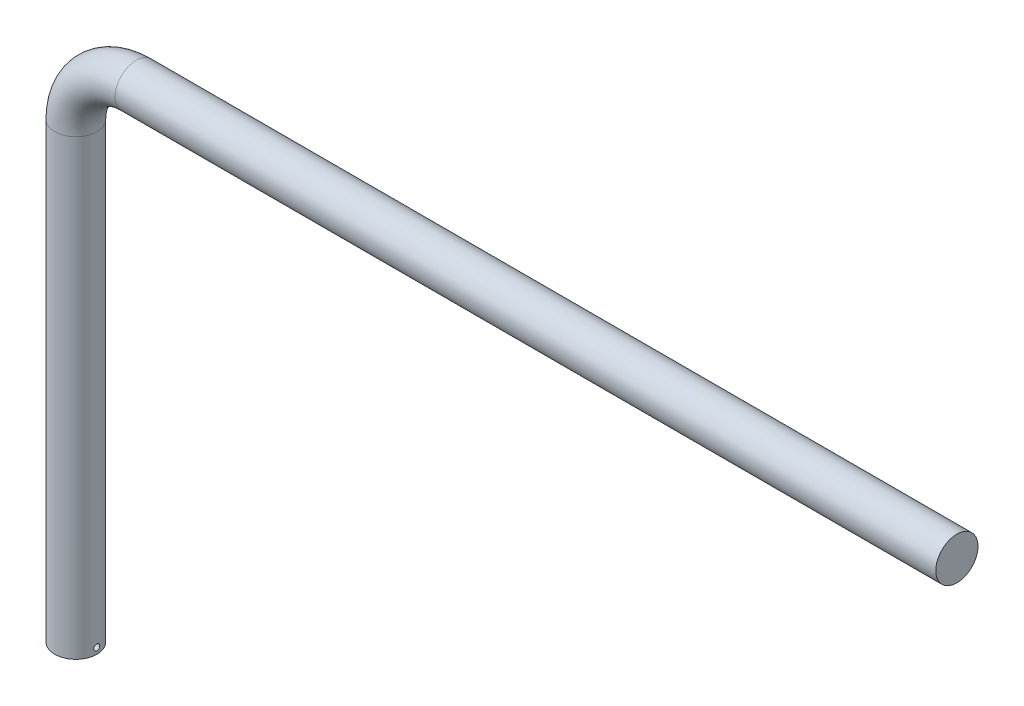
ISO-10303-21;
HEADER;
FILE_DESCRIPTION(('STEP AP214'),'2;1');
FILE_NAME('part.step','',(''),(''),'','','');
FILE_SCHEMA(('AUTOMOTIVE_DESIGN { 1 0 10303 214 1 1 1 1 }'));
ENDSEC;
DATA;
#1=APPLICATION_CONTEXT('core data for automotive mechanical design processes');
#2=APPLICATION_PROTOCOL_DEFINITION('international standard','automotive_design',2000,#1);
#3=PRODUCT_CONTEXT('',#1,'mechanical');
#4=PRODUCT('Part','Part','',(#3));
#5=PRODUCT_RELATED_PRODUCT_CATEGORY('part','',(#4));
#6=PRODUCT_DEFINITION_FORMATION('','',#4);
#7=PRODUCT_DEFINITION_CONTEXT('part definition',#1,'design');
#8=PRODUCT_DEFINITION('design','',#6,#7);
#9=PRODUCT_DEFINITION_SHAPE('','',#8);
#10=(LENGTH_UNIT() NAMED_UNIT(*) SI_UNIT(.MILLI.,.METRE.));
#11=(NAMED_UNIT(*) PLANE_ANGLE_UNIT() SI_UNIT($,.RADIAN.));
#12=(NAMED_UNIT(*) SI_UNIT($,.STERADIAN.) SOLID_ANGLE_UNIT());
#13=UNCERTAINTY_MEASURE_WITH_UNIT(LENGTH_MEASURE(1.E-05),#10,'distance_accuracy_value','');
#14=(GEOMETRIC_REPRESENTATION_CONTEXT(3) GLOBAL_UNCERTAINTY_ASSIGNED_CONTEXT((#13)) GLOBAL_UNIT_ASSIGNED_CONTEXT((#10,
#11,#12)) REPRESENTATION_CONTEXT('',''));
#15=CARTESIAN_POINT('',(0.,0.,0.));
#16=DIRECTION('',(0.,0.,1.));
#17=DIRECTION('',(1.,0.,0.));
#18=AXIS2_PLACEMENT_3D('',#15,#16,#17);
#19=CARTESIAN_POINT('',(-146.,-85.,0.));
#20=DIRECTION('',(0.,1.,0.));
#21=DIRECTION('',(0.,0.,1.));
#22=AXIS2_PLACEMENT_3D('',#19,#20,#21);
#23=CYLINDRICAL_SURFACE('',#22,3.5);
#24=CARTESIAN_POINT('',(-149.464101615138,-84.,0.5));
#25=CARTESIAN_POINT('',(-149.464102064343,-84.0279310428078,0.499998835290119));
#26=CARTESIAN_POINT('',(-149.464443080209,-84.0558786781863,0.497651661268469));
#27=CARTESIAN_POINT('',(-149.465769498112,-84.1109936590995,0.488326850345959));
#28=CARTESIAN_POINT('',(-149.466755542284,-84.1381601988775,0.481344599054395));
#29=CARTESIAN_POINT('',(-149.469258106532,-84.1909071750095,0.462961847090697));
#30=CARTESIAN_POINT('',(-149.470774233749,-84.2164887695258,0.451564617805074));
#31=CARTESIAN_POINT('',(-149.474165666516,-84.2653724323664,0.424682939723157));
#32=CARTESIAN_POINT('',(-149.476040918992,-84.2886748367599,0.40919909475185));
#33=CARTESIAN_POINT('',(-149.479954563133,-84.332512073962,0.374463367100464));
#34=CARTESIAN_POINT('',(-149.48199393618,-84.3530279284665,0.355187641068322));
#35=CARTESIAN_POINT('',(-149.485997257798,-84.3905453893101,0.313466769741803));
#36=CARTESIAN_POINT('',(-149.487961202339,-84.4075468081601,0.291021455462788));
#37=CARTESIAN_POINT('',(-149.491602592557,-84.4376222744399,0.243477596005121));
#38=CARTESIAN_POINT('',(-149.493278755734,-84.4506789286296,0.218367941554022));
#39=CARTESIAN_POINT('',(-149.496144878632,-84.472382683832,0.166284186490771));
#40=CARTESIAN_POINT('',(-149.497334861709,-84.4810299966619,0.139310175509827));
#41=CARTESIAN_POINT('',(-149.499087625022,-84.4936123017411,0.0844585158852308));
#42=CARTESIAN_POINT('',(-149.499654625795,-84.4975790174916,0.0565882812674637));
#43=CARTESIAN_POINT('',(-149.50011198871,-84.5007859746417,0.000572391319595767));
#44=CARTESIAN_POINT('',(-149.500002385131,-84.5000264554916,-0.0275732499851478));
#45=CARTESIAN_POINT('',(-149.499122273658,-84.4938276554461,-0.083124748046468));
#46=CARTESIAN_POINT('',(-149.498356585331,-84.4884225002794,-0.110534499942758));
#47=CARTESIAN_POINT('',(-149.496255713532,-84.4731393600752,-0.164053898782172));
#48=CARTESIAN_POINT('',(-149.494920516527,-84.4632612687531,-0.19016351481547));
#49=CARTESIAN_POINT('',(-149.491822350927,-84.4392773138041,-0.240445491691937));
#50=CARTESIAN_POINT('',(-149.490057920429,-84.4251569622203,-0.264610848197772));
#51=CARTESIAN_POINT('',(-149.486298166741,-84.3930998768149,-0.310241955034415));
#52=CARTESIAN_POINT('',(-149.48430282975,-84.3751629148392,-0.331707543852957));
#53=CARTESIAN_POINT('',(-149.48028301236,-84.335791349581,-0.371530747765961));
#54=CARTESIAN_POINT('',(-149.478258430778,-84.3143269668127,-0.389858923330456));
#55=CARTESIAN_POINT('',(-149.474425734689,-84.2686113696427,-0.422657473975307));
#56=CARTESIAN_POINT('',(-149.472617621291,-84.2443601409636,-0.437127829290445));
#57=CARTESIAN_POINT('',(-149.469422634207,-84.1937299275235,-0.461803253801985));
#58=CARTESIAN_POINT('',(-149.468036039425,-84.1673495485294,-0.472005500629443));
#59=CARTESIAN_POINT('',(-149.465846164522,-84.1132256050436,-0.4878265592708));
#60=CARTESIAN_POINT('',(-149.46504284729,-84.0854821274021,-0.493445662700757));
#61=CARTESIAN_POINT('',(-149.464117451893,-84.0296808656425,-0.499900976720485));
#62=CARTESIAN_POINT('',(-149.463989443008,-84.0016279935011,-0.500778827761179));
#63=CARTESIAN_POINT('',(-149.464413431332,-83.9457755487437,-0.497837020617802));
#64=CARTESIAN_POINT('',(-149.464965409466,-83.9179759690442,-0.494017494208426));
#65=CARTESIAN_POINT('',(-149.466681741313,-83.8635469549929,-0.481824594638002));
#66=CARTESIAN_POINT('',(-149.467843328363,-83.8369128182337,-0.473471789611049));
#67=CARTESIAN_POINT('',(-149.47064572803,-83.7854228006359,-0.452470765428657));
#68=CARTESIAN_POINT('',(-149.472286562274,-83.7605670001096,-0.439822352425354));
#69=CARTESIAN_POINT('',(-149.475876621034,-83.7131520300696,-0.410488400828067));
#70=CARTESIAN_POINT('',(-149.477827881131,-83.6906097596969,-0.393775800067815));
#71=CARTESIAN_POINT('',(-149.481812727165,-83.6486350690936,-0.356825694553414));
#72=CARTESIAN_POINT('',(-149.483846317307,-83.6292028079853,-0.336588009550542));
#73=CARTESIAN_POINT('',(-149.487785131035,-83.5938511953916,-0.292979271571337));
#74=CARTESIAN_POINT('',(-149.489689273905,-83.5779593694201,-0.269585793031079));
#75=CARTESIAN_POINT('',(-149.493138053899,-83.5503311092161,-0.220437176192795));
#76=CARTESIAN_POINT('',(-149.494682700101,-83.5385945700655,-0.194682097544112));
#77=CARTESIAN_POINT('',(-149.497233694611,-83.5196544714211,-0.141628981148482));
#78=CARTESIAN_POINT('',(-149.498241859143,-83.5124356028431,-0.114336499780981));
#79=CARTESIAN_POINT('',(-149.499613897791,-83.5026861332234,-0.0589113147614449));
#80=CARTESIAN_POINT('',(-149.499977810338,-83.5001552525366,-0.0307786613285681));
#81=CARTESIAN_POINT('',(-149.50002001918,-83.4998599402639,0.0252607826567915));
#82=CARTESIAN_POINT('',(-149.499704387556,-83.5020532952454,0.053167355437649));
#83=CARTESIAN_POINT('',(-149.498435160688,-83.5110540375108,0.108210658369971));
#84=CARTESIAN_POINT('',(-149.497481566949,-83.517861413901,0.135347390338862));
#85=CARTESIAN_POINT('',(-149.495043055136,-83.5358824943571,0.188070928624312));
#86=CARTESIAN_POINT('',(-149.493558457049,-83.5470935451212,0.213658657551745));
#87=CARTESIAN_POINT('',(-149.490221400256,-83.5735992873005,0.262596426462869));
#88=CARTESIAN_POINT('',(-149.488368931861,-83.5888940862645,0.285946407491637));
#89=CARTESIAN_POINT('',(-149.484482618659,-83.6232869288059,0.329960487400662));
#90=CARTESIAN_POINT('',(-149.482447364648,-83.6424162267081,0.350600041579962));
#91=CARTESIAN_POINT('',(-149.478435558565,-83.6838693900588,0.388391791818105));
#92=CARTESIAN_POINT('',(-149.476459020412,-83.7061940057492,0.405543166576822));
#93=CARTESIAN_POINT('',(-149.47277771963,-83.7535363595839,0.435948808688982));
#94=CARTESIAN_POINT('',(-149.47107438507,-83.7785671726028,0.449182885752495));
#95=CARTESIAN_POINT('',(-149.468149070338,-83.8305080741512,0.471239756267737));
#96=CARTESIAN_POINT('',(-149.46692658359,-83.8574161495794,0.480067194805341));
#97=CARTESIAN_POINT('',(-149.465388230548,-83.9037091064576,0.491023137913954));
#98=CARTESIAN_POINT('',(-149.464908259985,-83.9228060838525,0.494384406323878));
#99=CARTESIAN_POINT('',(-149.464264798279,-83.9612660492417,0.498873228771315));
#100=CARTESIAN_POINT('',(-149.464101303601,-83.9806290342623,0.500000807759143));
#101=CARTESIAN_POINT('',(-149.464101615138,-84.,0.5));
#102=B_SPLINE_CURVE_WITH_KNOTS('',3,(#24,#25,#26,#27,#28,#29,#30,#31,#32,#33,#34,#35,#36,#37,
#38,#39,#40,#41,#42,#43,#44,#45,#46,#47,#48,#49,#50,#51,#52,#53,#54,#55,#56,#57,#58,#59,#60,#61,
#62,#63,#64,#65,#66,#67,#68,#69,#70,#71,#72,#73,#74,#75,#76,#77,#78,#79,#80,#81,#82,#83,#84,#85,
#86,#87,#88,#89,#90,#91,#92,#93,#94,#95,#96,#97,#98,#99,#100,#101),.UNSPECIFIED.,.T.,.F.,(4,2,2,
2,2,2,2,2,2,2,2,2,2,2,2,2,2,2,2,2,2,2,2,2,2,2,2,2,2,2,2,2,2,2,2,2,2,2,4),(0.,0.0837223373489682,
0.167528148625222,0.251271980342055,0.335003445264401,0.419279289116181,0.503559627779989,
0.58820632668366,0.672848958921207,0.756914555340199,0.840975892688901,0.924424962262251,
1.00787601483293,1.09161536909713,1.17535973064625,1.25985129495925,1.34434329214934,
1.42889107332131,1.51343347447084,1.59723215270005,1.68102848019342,1.7644477520044,
1.84787078877647,1.93186530252231,2.01586411243515,2.10049480379907,2.1851233581478,
2.26946355534092,2.35379872136241,2.43738343825382,2.5209679578034,2.60450219307146,
2.68803862849862,2.7722858732653,2.85655293133938,2.94124703877999,3.02585167971591,
3.08391612990671,3.14197993151379),.UNSPECIFIED.);
#103=CARTESIAN_POINT('',(-149.464101615138,-84.,0.5));
#104=VERTEX_POINT('',#103);
#105=EDGE_CURVE('E51',#104,#104,#102,.T.);
#106=ORIENTED_EDGE('',*,*,#105,.T.);
#107=EDGE_LOOP('',(#106));
#108=FACE_BOUND('',#107,.T.);
#109=CARTESIAN_POINT('',(-146.,-10.,0.));
#110=DIRECTION('',(0.,1.,0.));
#111=DIRECTION('',(0.,0.,-1.));
#112=AXIS2_PLACEMENT_3D('',#109,#110,#111);
#113=CIRCLE('',#112,3.5);
#114=CARTESIAN_POINT('',(-149.5,-10.,0.));
#115=VERTEX_POINT('',#114);
#116=EDGE_CURVE('E48',#115,#115,#113,.T.);
#117=ORIENTED_EDGE('',*,*,#116,.F.);
#118=EDGE_LOOP('',(#117));
#119=FACE_BOUND('',#118,.T.);
#120=CARTESIAN_POINT('',(-146.,-85.,0.));
#121=DIRECTION('',(0.,1.,0.));
#122=DIRECTION('',(0.,0.,-1.));
#123=AXIS2_PLACEMENT_3D('',#120,#121,#122);
#124=CIRCLE('',#123,3.5);
#125=CARTESIAN_POINT('',(-146.,-85.,-3.5));
#126=VERTEX_POINT('',#125);
#127=EDGE_CURVE('E87',#126,#126,#124,.T.);
#128=ORIENTED_EDGE('',*,*,#127,.T.);
#129=EDGE_LOOP('',(#128));
#130=FACE_BOUND('',#129,.T.);
#131=CARTESIAN_POINT('',(-142.535898384862,-84.,0.5));
#132=CARTESIAN_POINT('',(-142.535897935657,-83.9720689571922,0.499998835290119));
#133=CARTESIAN_POINT('',(-142.535556919791,-83.9441213218137,0.497651661268469));
#134=CARTESIAN_POINT('',(-142.534230501888,-83.8890063409005,0.488326850345959));
#135=CARTESIAN_POINT('',(-142.533244457716,-83.8618398011225,0.481344599054395));
#136=CARTESIAN_POINT('',(-142.530741893468,-83.8090928249906,0.462961847090698));
#137=CARTESIAN_POINT('',(-142.529225766251,-83.7835112304743,0.451564617805074));
#138=CARTESIAN_POINT('',(-142.525834333484,-83.7346275676336,0.424682939723157));
#139=CARTESIAN_POINT('',(-142.523959081008,-83.7113251632401,0.409199094751849));
#140=CARTESIAN_POINT('',(-142.520045436867,-83.667487926038,0.374463367100462));
#141=CARTESIAN_POINT('',(-142.51800606382,-83.6469720715335,0.355187641068319));
#142=CARTESIAN_POINT('',(-142.514002742202,-83.6094546106899,0.313466769741799));
#143=CARTESIAN_POINT('',(-142.512038797661,-83.59245319184,0.291021455462786));
#144=CARTESIAN_POINT('',(-142.508397407443,-83.5623777255601,0.24347759600512));
#145=CARTESIAN_POINT('',(-142.506721244266,-83.5493210713704,0.218367941554022));
#146=CARTESIAN_POINT('',(-142.503855121368,-83.5276173161681,0.166284186490772));
#147=CARTESIAN_POINT('',(-142.502665138291,-83.5189700033382,0.139310175509827));
#148=CARTESIAN_POINT('',(-142.500912374978,-83.5063876982589,0.0844585158852308));
#149=CARTESIAN_POINT('',(-142.500345374205,-83.5024209825085,0.0565882812674636));
#150=CARTESIAN_POINT('',(-142.49988801129,-83.4992140253584,0.000572391319595797));
#151=CARTESIAN_POINT('',(-142.499997614869,-83.4999735445085,-0.0275732499851477));
#152=CARTESIAN_POINT('',(-142.500877726342,-83.506172344554,-0.0831247480464681));
#153=CARTESIAN_POINT('',(-142.501643414669,-83.5115774997206,-0.110534499942758));
#154=CARTESIAN_POINT('',(-142.503744286468,-83.5268606399248,-0.164053898782171));
#155=CARTESIAN_POINT('',(-142.505079483473,-83.536738731247,-0.190163514815469));
#156=CARTESIAN_POINT('',(-142.508177649073,-83.5607226861959,-0.240445491691934));
#157=CARTESIAN_POINT('',(-142.509942079571,-83.5748430377797,-0.264610848197769));
#158=CARTESIAN_POINT('',(-142.513701833259,-83.6069001231851,-0.310241955034412));
#159=CARTESIAN_POINT('',(-142.51569717025,-83.6248370851608,-0.331707543852954));
#160=CARTESIAN_POINT('',(-142.51971698764,-83.664208650419,-0.37153074776596));
#161=CARTESIAN_POINT('',(-142.521741569222,-83.6856730331873,-0.389858923330456));
#162=CARTESIAN_POINT('',(-142.525574265311,-83.7313886303574,-0.422657473975307));
#163=CARTESIAN_POINT('',(-142.527382378709,-83.7556398590364,-0.437127829290445));
#164=CARTESIAN_POINT('',(-142.530577365793,-83.8062700724766,-0.461803253801985));
#165=CARTESIAN_POINT('',(-142.531963960575,-83.8326504514707,-0.472005500629443));
#166=CARTESIAN_POINT('',(-142.534153835478,-83.8867743949565,-0.4878265592708));
#167=CARTESIAN_POINT('',(-142.53495715271,-83.9145178725979,-0.493445662700757));
#168=CARTESIAN_POINT('',(-142.535882548107,-83.9703191343575,-0.499900976720485));
#169=CARTESIAN_POINT('',(-142.536010556992,-83.9983720064989,-0.500778827761179));
#170=CARTESIAN_POINT('',(-142.535586568668,-84.0542244512563,-0.497837020617802));
#171=CARTESIAN_POINT('',(-142.535034590534,-84.0820240309558,-0.494017494208426));
#172=CARTESIAN_POINT('',(-142.533318258687,-84.1364530450071,-0.481824594638002));
#173=CARTESIAN_POINT('',(-142.532156671637,-84.1630871817664,-0.473471789611049));
#174=CARTESIAN_POINT('',(-142.52935427197,-84.2145771993641,-0.452470765428657));
#175=CARTESIAN_POINT('',(-142.527713437726,-84.2394329998905,-0.439822352425354));
#176=CARTESIAN_POINT('',(-142.524123378966,-84.2868479699304,-0.410488400828065));
#177=CARTESIAN_POINT('',(-142.522172118869,-84.3093902403031,-0.393775800067811));
#178=CARTESIAN_POINT('',(-142.518187272835,-84.3513649309064,-0.356825694553409));
#179=CARTESIAN_POINT('',(-142.516153682693,-84.3707971920148,-0.33658800955054));
#180=CARTESIAN_POINT('',(-142.512214868965,-84.4061488046085,-0.292979271571339));
#181=CARTESIAN_POINT('',(-142.510310726095,-84.4220406305799,-0.269585793031084));
#182=CARTESIAN_POINT('',(-142.5068619461,-84.449668890784,-0.2204371761928));
#183=CARTESIAN_POINT('',(-142.505317299899,-84.4614054299345,-0.194682097544114));
#184=CARTESIAN_POINT('',(-142.502766305389,-84.480345528579,-0.141628981148482));
#185=CARTESIAN_POINT('',(-142.501758140857,-84.4875643971569,-0.114336499780981));
#186=CARTESIAN_POINT('',(-142.500386102209,-84.4973138667767,-0.058911314761445));
#187=CARTESIAN_POINT('',(-142.500022189662,-84.4998447474635,-0.0307786613285681));
#188=CARTESIAN_POINT('',(-142.49997998082,-84.5001400597361,0.0252607826567913));
#189=CARTESIAN_POINT('',(-142.500295612444,-84.4979467047546,0.0531673554376486));
#190=CARTESIAN_POINT('',(-142.501564839312,-84.4889459624893,0.10821065836997));
#191=CARTESIAN_POINT('',(-142.502518433051,-84.4821385860991,0.135347390338862));
#192=CARTESIAN_POINT('',(-142.504956944864,-84.464117505643,0.188070928624312));
#193=CARTESIAN_POINT('',(-142.506441542951,-84.4529064548788,0.213658657551745));
#194=CARTESIAN_POINT('',(-142.509778599744,-84.4264007126995,0.262596426462869));
#195=CARTESIAN_POINT('',(-142.511631068139,-84.4111059137355,0.285946407491637));
#196=CARTESIAN_POINT('',(-142.515517381341,-84.3767130711942,0.329960487400662));
#197=CARTESIAN_POINT('',(-142.517552635352,-84.3575837732919,0.350600041579962));
#198=CARTESIAN_POINT('',(-142.521564441435,-84.3161306099412,0.388391791818105));
#199=CARTESIAN_POINT('',(-142.523540979588,-84.2938059942509,0.405543166576822));
#200=CARTESIAN_POINT('',(-142.52722228037,-84.2464636404161,0.435948808688982));
#201=CARTESIAN_POINT('',(-142.52892561493,-84.2214328273973,0.449182885752495));
#202=CARTESIAN_POINT('',(-142.531850929662,-84.1694919258489,0.471239756267737));
#203=CARTESIAN_POINT('',(-142.53307341641,-84.1425838504206,0.480067194805341));
#204=CARTESIAN_POINT('',(-142.534611769452,-84.0962908935424,0.491023137913954));
#205=CARTESIAN_POINT('',(-142.535091740015,-84.0771939161476,0.494384406323878));
#206=CARTESIAN_POINT('',(-142.535735201721,-84.0387339507584,0.498873228771315));
#207=CARTESIAN_POINT('',(-142.535898696399,-84.0193709657378,0.500000807759143));
#208=CARTESIAN_POINT('',(-142.535898384862,-84.,0.5));
#209=B_SPLINE_CURVE_WITH_KNOTS('',3,(#131,#132,#133,#134,#135,#136,#137,#138,#139,#140,#141,
#142,#143,#144,#145,#146,#147,#148,#149,#150,#151,#152,#153,#154,#155,#156,#157,#158,#159,#160,
#161,#162,#163,#164,#165,#166,#167,#168,#169,#170,#171,#172,#173,#174,#175,#176,#177,#178,#179,
#180,#181,#182,#183,#184,#185,#186,#187,#188,#189,#190,#191,#192,#193,#194,#195,#196,#197,#198,
#199,#200,#201,#202,#203,#204,#205,#206,#207,#208),.UNSPECIFIED.,.T.,.F.,(4,2,2,2,2,2,2,2,2,2,2,
2,2,2,2,2,2,2,2,2,2,2,2,2,2,2,2,2,2,2,2,2,2,2,2,2,2,2,4),(0.,0.0837223373489682,
0.167528148625222,0.251271980342055,0.335003445264401,0.419279289116196,0.50355962777999,
0.588206326683661,0.672848958921208,0.7569145553402,0.840975892688902,0.924424962262252,
1.00787601483293,1.09161536909712,1.17535973064625,1.25985129495925,1.34434329214934,
1.42889107332132,1.51343347447084,1.59723215270005,1.68102848019343,1.7644477520044,
1.84787078877647,1.93186530252231,2.01586411243515,2.10049480379906,2.1851233581478,
2.26946355534092,2.35379872136241,2.43738343825382,2.5209679578034,2.60450219307146,
2.68803862849863,2.7722858732653,2.85655293133939,2.94124703877999,3.02585167971591,
3.08391612990671,3.14197993151379),.UNSPECIFIED.);
#210=CARTESIAN_POINT('',(-142.535898384862,-84.,0.5));
#211=VERTEX_POINT('',#210);
#212=EDGE_CURVE('E34',#211,#211,#209,.T.);
#213=ORIENTED_EDGE('',*,*,#212,.T.);
#214=EDGE_LOOP('',(#213));
#215=FACE_BOUND('',#214,.T.);
#216=ADVANCED_FACE('F30',(#108,#119,#130,#215),#23,.T.);
#217=CARTESIAN_POINT('',(-146.,-85.,0.));
#218=DIRECTION('',(0.,1.,0.));
#219=DIRECTION('',(0.,0.,-1.));
#220=AXIS2_PLACEMENT_3D('',#217,#218,#219);
#221=PLANE('',#220);
#222=ORIENTED_EDGE('',*,*,#127,.F.);
#223=EDGE_LOOP('',(#222));
#224=FACE_BOUND('',#223,.T.);
#225=ADVANCED_FACE('F32',(#224),#221,.F.);
#226=CARTESIAN_POINT('',(0.,0.,0.));
#227=DIRECTION('',(1.,0.,0.));
#228=DIRECTION('',(0.,0.,-1.));
#229=AXIS2_PLACEMENT_3D('',#226,#227,#228);
#230=PLANE('',#229);
#231=CARTESIAN_POINT('',(0.,0.,0.));
#232=DIRECTION('',(1.,0.,0.));
#233=DIRECTION('',(0.,0.,-1.));
#234=AXIS2_PLACEMENT_3D('',#231,#232,#233);
#235=CIRCLE('',#234,3.5);
#236=CARTESIAN_POINT('',(0.,0.,-3.5));
#237=VERTEX_POINT('',#236);
#238=EDGE_CURVE('E10',#237,#237,#235,.T.);
#239=ORIENTED_EDGE('',*,*,#238,.T.);
#240=EDGE_LOOP('',(#239));
#241=FACE_BOUND('',#240,.T.);
#242=ADVANCED_FACE('F73',(#241),#230,.T.);
#243=CARTESIAN_POINT('',(-136.,-10.,0.));
#244=DIRECTION('',(0.,0.,-1.));
#245=DIRECTION('',(-1.,0.,0.));
#246=AXIS2_PLACEMENT_3D('',#243,#244,#245);
#247=TOROIDAL_SURFACE('',#246,10.,3.5);
#248=CARTESIAN_POINT('',(-136.,0.,0.));
#249=DIRECTION('',(1.,0.,0.));
#250=DIRECTION('',(0.,0.,-1.));
#251=AXIS2_PLACEMENT_3D('',#248,#249,#250);
#252=CIRCLE('',#251,3.5);
#253=CARTESIAN_POINT('',(-136.,3.50000000000001,0.));
#254=VERTEX_POINT('',#253);
#255=EDGE_CURVE('E43',#254,#254,#252,.T.);
#256=CARTESIAN_POINT('',(-136.,-10.,0.));
#257=DIRECTION('',(0.,0.,-1.));
#258=DIRECTION('',(-1.,0.,0.));
#259=AXIS2_PLACEMENT_3D('',#256,#257,#258);
#260=CIRCLE('',#259,13.5);
#261=EDGE_CURVE('',#115,#254,#260,.T.);
#262=ORIENTED_EDGE('',*,*,#116,.T.);
#263=ORIENTED_EDGE('',*,*,#255,.F.);
#264=ORIENTED_EDGE('',*,*,#261,.T.);
#265=ORIENTED_EDGE('',*,*,#261,.F.);
#266=EDGE_LOOP('',(#262,#264,#263,#265));
#267=FACE_BOUND('',#266,.T.);
#268=ADVANCED_FACE('F67',(#267),#247,.T.);
#269=CARTESIAN_POINT('',(-136.,0.,0.));
#270=DIRECTION('',(1.,0.,0.));
#271=DIRECTION('',(0.,0.,-1.));
#272=AXIS2_PLACEMENT_3D('',#269,#270,#271);
#273=CYLINDRICAL_SURFACE('',#272,3.5);
#274=ORIENTED_EDGE('',*,*,#238,.F.);
#275=EDGE_LOOP('',(#274));
#276=FACE_BOUND('',#275,.T.);
#277=ORIENTED_EDGE('',*,*,#255,.T.);
#278=EDGE_LOOP('',(#277));
#279=FACE_BOUND('',#278,.T.);
#280=ADVANCED_FACE('F61',(#276,#279),#273,.T.);
#281=CARTESIAN_POINT('',(-149.5,-84.,0.));
#282=DIRECTION('',(-1.,0.,0.));
#283=DIRECTION('',(0.,0.,1.));
#284=AXIS2_PLACEMENT_3D('',#281,#282,#283);
#285=CYLINDRICAL_SURFACE('',#284,0.5);
#286=ORIENTED_EDGE('',*,*,#212,.F.);
#287=EDGE_LOOP('',(#286));
#288=FACE_BOUND('',#287,.T.);
#289=ORIENTED_EDGE('',*,*,#105,.F.);
#290=EDGE_LOOP('',(#289));
#291=FACE_BOUND('',#290,.T.);
#292=ADVANCED_FACE('F58',(#288,#291),#285,.F.);
#293=CLOSED_SHELL('',(#216,#225,#242,#268,#280,#292));
#294=MANIFOLD_SOLID_BREP('B2',#293);
#295=ADVANCED_BREP_SHAPE_REPRESENTATION('',(#18,#294),#14);
#296=SHAPE_DEFINITION_REPRESENTATION(#9,#295);
ENDSEC;
END-ISO-10303-21;
